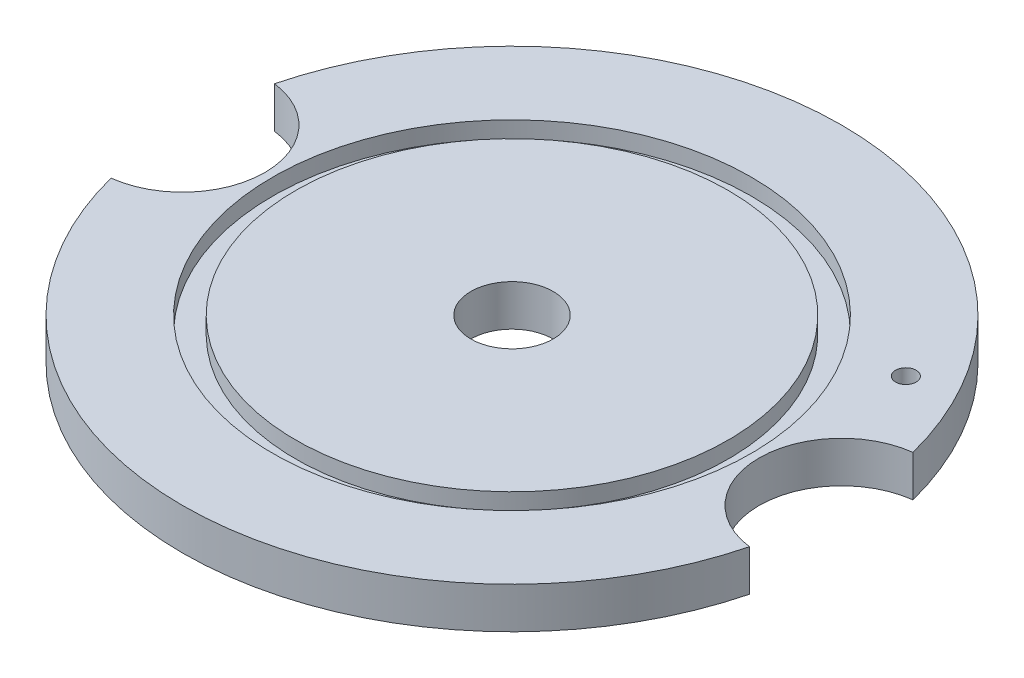
ISO-10303-21;
HEADER;
FILE_DESCRIPTION(('STEP AP214'),'2;1');
FILE_NAME('part.step','',(''),(''),'','','');
FILE_SCHEMA(('AUTOMOTIVE_DESIGN { 1 0 10303 214 1 1 1 1 }'));
ENDSEC;
DATA;
#1=APPLICATION_CONTEXT('core data for automotive mechanical design processes');
#2=APPLICATION_PROTOCOL_DEFINITION('international standard','automotive_design',2000,#1);
#3=PRODUCT_CONTEXT('',#1,'mechanical');
#4=PRODUCT('Part','Part','',(#3));
#5=PRODUCT_RELATED_PRODUCT_CATEGORY('part','',(#4));
#6=PRODUCT_DEFINITION_FORMATION('','',#4);
#7=PRODUCT_DEFINITION_CONTEXT('part definition',#1,'design');
#8=PRODUCT_DEFINITION('design','',#6,#7);
#9=PRODUCT_DEFINITION_SHAPE('','',#8);
#10=(LENGTH_UNIT() NAMED_UNIT(*) SI_UNIT(.MILLI.,.METRE.));
#11=(NAMED_UNIT(*) PLANE_ANGLE_UNIT() SI_UNIT($,.RADIAN.));
#12=(NAMED_UNIT(*) SI_UNIT($,.STERADIAN.) SOLID_ANGLE_UNIT());
#13=UNCERTAINTY_MEASURE_WITH_UNIT(LENGTH_MEASURE(1.E-05),#10,'distance_accuracy_value','');
#14=(GEOMETRIC_REPRESENTATION_CONTEXT(3) GLOBAL_UNCERTAINTY_ASSIGNED_CONTEXT((#13)) GLOBAL_UNIT_ASSIGNED_CONTEXT((#10,
#11,#12)) REPRESENTATION_CONTEXT('',''));
#15=CARTESIAN_POINT('',(0.,0.,0.));
#16=DIRECTION('',(0.,0.,1.));
#17=DIRECTION('',(1.,0.,0.));
#18=AXIS2_PLACEMENT_3D('',#15,#16,#17);
#19=CARTESIAN_POINT('',(0.,0.,0.));
#20=DIRECTION('',(0.,-1.,0.));
#21=DIRECTION('',(0.,0.,-1.));
#22=AXIS2_PLACEMENT_3D('',#19,#20,#21);
#23=CYLINDRICAL_SURFACE('',#22,50.8);
#24=CARTESIAN_POINT('',(0.,0.,0.));
#25=DIRECTION('',(0.,-1.,0.));
#26=DIRECTION('',(0.,0.,-1.));
#27=AXIS2_PLACEMENT_3D('',#24,#25,#26);
#28=CIRCLE('',#27,50.8);
#29=CARTESIAN_POINT('',(49.2125,0.,12.6003906189451));
#30=VERTEX_POINT('',#29);
#31=CARTESIAN_POINT('',(-49.2125,0.,12.6003906189451));
#32=VERTEX_POINT('',#31);
#33=EDGE_CURVE('E62',#30,#32,#28,.T.);
#34=ORIENTED_EDGE('',*,*,#33,.F.);
#35=DIRECTION('',(0.,1.,0.));
#36=VECTOR('',#35,1.);
#37=CARTESIAN_POINT('',(49.2125,3.17499999999999,12.6003906189451));
#38=LINE('',#37,#36);
#39=CARTESIAN_POINT('',(49.2125,6.35,12.6003906189451));
#40=VERTEX_POINT('',#39);
#41=EDGE_CURVE('E11',#30,#40,#38,.T.);
#42=ORIENTED_EDGE('',*,*,#41,.T.);
#43=CARTESIAN_POINT('',(0.,6.35,0.));
#44=DIRECTION('',(0.,-1.,0.));
#45=DIRECTION('',(0.,0.,-1.));
#46=AXIS2_PLACEMENT_3D('',#43,#44,#45);
#47=CIRCLE('',#46,50.8);
#48=CARTESIAN_POINT('',(-49.2125,6.35,12.6003906189451));
#49=VERTEX_POINT('',#48);
#50=EDGE_CURVE('E99',#40,#49,#47,.T.);
#51=ORIENTED_EDGE('',*,*,#50,.T.);
#52=DIRECTION('',(0.,1.,0.));
#53=VECTOR('',#52,1.);
#54=CARTESIAN_POINT('',(-49.2125,3.17499999999999,12.6003906189451));
#55=LINE('',#54,#53);
#56=EDGE_CURVE('E93',#49,#32,#55,.F.);
#57=ORIENTED_EDGE('',*,*,#56,.T.);
#58=EDGE_LOOP('',(#34,#42,#51,#57));
#59=FACE_BOUND('',#58,.T.);
#60=ADVANCED_FACE('F39',(#59),#23,.T.);
#61=CARTESIAN_POINT('',(-36.8935,6.35,0.));
#62=DIRECTION('',(0.,-1.,0.));
#63=DIRECTION('',(0.,0.,-1.));
#64=AXIS2_PLACEMENT_3D('',#61,#62,#63);
#65=PLANE('',#64);
#66=CARTESIAN_POINT('',(38.4948291982183,6.35,-22.2250000000001));
#67=DIRECTION('',(0.,1.,0.));
#68=DIRECTION('',(0.,0.,1.));
#69=AXIS2_PLACEMENT_3D('',#66,#67,#68);
#70=CIRCLE('',#69,1.5875);
#71=CARTESIAN_POINT('',(38.4948291982183,6.35,-20.6375000000001));
#72=VERTEX_POINT('',#71);
#73=EDGE_CURVE('E142',#72,#72,#70,.T.);
#74=ORIENTED_EDGE('',*,*,#73,.F.);
#75=EDGE_LOOP('',(#74));
#76=FACE_BOUND('',#75,.T.);
#77=CARTESIAN_POINT('',(0.,6.35,0.));
#78=DIRECTION('',(0.,-1.,0.));
#79=DIRECTION('',(0.,0.,-1.));
#80=AXIS2_PLACEMENT_3D('',#77,#78,#79);
#81=CIRCLE('',#80,36.8935);
#82=CARTESIAN_POINT('',(0.,6.35,-36.8935));
#83=VERTEX_POINT('',#82);
#84=EDGE_CURVE('E109',#83,#83,#81,.T.);
#85=ORIENTED_EDGE('',*,*,#84,.T.);
#86=EDGE_LOOP('',(#85));
#87=FACE_BOUND('',#86,.T.);
#88=ORIENTED_EDGE('',*,*,#50,.F.);
#89=CARTESIAN_POINT('',(50.8,6.35,0.));
#90=DIRECTION('',(0.,1.,0.));
#91=DIRECTION('',(0.,0.,1.));
#92=AXIS2_PLACEMENT_3D('',#89,#90,#91);
#93=CIRCLE('',#92,12.7);
#94=CARTESIAN_POINT('',(49.2125,6.35,-12.6003906189451));
#95=VERTEX_POINT('',#94);
#96=EDGE_CURVE('E81',#95,#40,#93,.T.);
#97=ORIENTED_EDGE('',*,*,#96,.F.);
#98=CARTESIAN_POINT('',(-49.2125,6.35,-12.6003906189451));
#99=VERTEX_POINT('',#98);
#100=EDGE_CURVE('E105',#99,#95,#47,.T.);
#101=ORIENTED_EDGE('',*,*,#100,.F.);
#102=CARTESIAN_POINT('',(-50.8,6.35,0.));
#103=DIRECTION('',(0.,1.,0.));
#104=DIRECTION('',(0.,0.,1.));
#105=AXIS2_PLACEMENT_3D('',#102,#103,#104);
#106=CIRCLE('',#105,12.7);
#107=EDGE_CURVE('E89',#49,#99,#106,.T.);
#108=ORIENTED_EDGE('',*,*,#107,.F.);
#109=EDGE_LOOP('',(#88,#97,#101,#108));
#110=FACE_BOUND('',#109,.T.);
#111=ADVANCED_FACE('F135',(#76,#87,#110),#65,.F.);
#112=CARTESIAN_POINT('',(0.,6.35,0.));
#113=DIRECTION('',(0.,-1.,0.));
#114=DIRECTION('',(0.,0.,-1.));
#115=AXIS2_PLACEMENT_3D('',#112,#113,#114);
#116=PLANE('',#115);
#117=CARTESIAN_POINT('',(0.,6.35,0.));
#118=DIRECTION('',(0.,1.,0.));
#119=DIRECTION('',(0.,0.,1.));
#120=AXIS2_PLACEMENT_3D('',#117,#118,#119);
#121=CIRCLE('',#120,6.35);
#122=CARTESIAN_POINT('',(0.,6.35,6.35));
#123=VERTEX_POINT('',#122);
#124=EDGE_CURVE('E101',#123,#123,#121,.T.);
#125=ORIENTED_EDGE('',*,*,#124,.F.);
#126=EDGE_LOOP('',(#125));
#127=FACE_BOUND('',#126,.T.);
#128=CARTESIAN_POINT('',(0.,6.35,0.));
#129=DIRECTION('',(0.,-1.,0.));
#130=DIRECTION('',(0.,0.,-1.));
#131=AXIS2_PLACEMENT_3D('',#128,#129,#130);
#132=CIRCLE('',#131,33.3375);
#133=CARTESIAN_POINT('',(0.,6.35,-33.3375));
#134=VERTEX_POINT('',#133);
#135=EDGE_CURVE('E121',#134,#134,#132,.T.);
#136=ORIENTED_EDGE('',*,*,#135,.F.);
#137=EDGE_LOOP('',(#136));
#138=FACE_BOUND('',#137,.T.);
#139=ADVANCED_FACE('F41',(#127,#138),#116,.F.);
#140=CARTESIAN_POINT('',(0.,0.,0.));
#141=DIRECTION('',(0.,-1.,0.));
#142=DIRECTION('',(0.,0.,-1.));
#143=AXIS2_PLACEMENT_3D('',#140,#141,#142);
#144=CYLINDRICAL_SURFACE('',#143,33.3375);
#145=CARTESIAN_POINT('',(0.,3.81,0.));
#146=DIRECTION('',(0.,-1.,0.));
#147=DIRECTION('',(0.,0.,-1.));
#148=AXIS2_PLACEMENT_3D('',#145,#146,#147);
#149=CIRCLE('',#148,33.3375);
#150=CARTESIAN_POINT('',(0.,3.81,-33.3375));
#151=VERTEX_POINT('',#150);
#152=EDGE_CURVE('E117',#151,#151,#149,.T.);
#153=ORIENTED_EDGE('',*,*,#152,.F.);
#154=EDGE_LOOP('',(#153));
#155=FACE_BOUND('',#154,.T.);
#156=ORIENTED_EDGE('',*,*,#135,.T.);
#157=EDGE_LOOP('',(#156));
#158=FACE_BOUND('',#157,.T.);
#159=ADVANCED_FACE('F158',(#155,#158),#144,.T.);
#160=CARTESIAN_POINT('',(-33.3375,3.81,0.));
#161=DIRECTION('',(0.,-1.,0.));
#162=DIRECTION('',(0.,0.,-1.));
#163=AXIS2_PLACEMENT_3D('',#160,#161,#162);
#164=PLANE('',#163);
#165=CARTESIAN_POINT('',(0.,3.81,0.));
#166=DIRECTION('',(0.,-1.,0.));
#167=DIRECTION('',(0.,0.,-1.));
#168=AXIS2_PLACEMENT_3D('',#165,#166,#167);
#169=CIRCLE('',#168,36.8935);
#170=CARTESIAN_POINT('',(0.,3.81,-36.8935));
#171=VERTEX_POINT('',#170);
#172=EDGE_CURVE('E113',#171,#171,#169,.T.);
#173=ORIENTED_EDGE('',*,*,#172,.F.);
#174=EDGE_LOOP('',(#173));
#175=FACE_BOUND('',#174,.T.);
#176=ORIENTED_EDGE('',*,*,#152,.T.);
#177=EDGE_LOOP('',(#176));
#178=FACE_BOUND('',#177,.T.);
#179=ADVANCED_FACE('F162',(#175,#178),#164,.F.);
#180=CARTESIAN_POINT('',(0.,0.,0.));
#181=DIRECTION('',(0.,-1.,0.));
#182=DIRECTION('',(0.,0.,-1.));
#183=AXIS2_PLACEMENT_3D('',#180,#181,#182);
#184=CYLINDRICAL_SURFACE('',#183,36.8935);
#185=ORIENTED_EDGE('',*,*,#84,.F.);
#186=EDGE_LOOP('',(#185));
#187=FACE_BOUND('',#186,.T.);
#188=ORIENTED_EDGE('',*,*,#172,.T.);
#189=EDGE_LOOP('',(#188));
#190=FACE_BOUND('',#189,.T.);
#191=ADVANCED_FACE('F167',(#187,#190),#184,.F.);
#192=ORIENTED_EDGE('',*,*,#100,.T.);
#193=DIRECTION('',(0.,1.,0.));
#194=VECTOR('',#193,1.);
#195=CARTESIAN_POINT('',(49.2125,3.17499999999999,-12.6003906189451));
#196=LINE('',#195,#194);
#197=CARTESIAN_POINT('',(49.2125,0.,-12.6003906189451));
#198=VERTEX_POINT('',#197);
#199=EDGE_CURVE('E48',#95,#198,#196,.F.);
#200=ORIENTED_EDGE('',*,*,#199,.T.);
#201=CARTESIAN_POINT('',(-49.2125,0.,-12.6003906189451));
#202=VERTEX_POINT('',#201);
#203=EDGE_CURVE('E87',#202,#198,#28,.T.);
#204=ORIENTED_EDGE('',*,*,#203,.F.);
#205=DIRECTION('',(0.,1.,0.));
#206=VECTOR('',#205,1.);
#207=CARTESIAN_POINT('',(-49.2125,3.17499999999999,-12.6003906189451));
#208=LINE('',#207,#206);
#209=EDGE_CURVE('E127',#202,#99,#208,.T.);
#210=ORIENTED_EDGE('',*,*,#209,.T.);
#211=EDGE_LOOP('',(#192,#200,#204,#210));
#212=FACE_BOUND('',#211,.T.);
#213=ADVANCED_FACE('F132',(#212),#23,.T.);
#214=CARTESIAN_POINT('',(0.,0.,0.));
#215=DIRECTION('',(0.,1.,0.));
#216=DIRECTION('',(0.,0.,1.));
#217=AXIS2_PLACEMENT_3D('',#214,#215,#216);
#218=PLANE('',#217);
#219=CARTESIAN_POINT('',(38.4948291982183,0.,-22.2250000000001));
#220=DIRECTION('',(0.,1.,0.));
#221=DIRECTION('',(0.,0.,1.));
#222=AXIS2_PLACEMENT_3D('',#219,#220,#221);
#223=CIRCLE('',#222,1.5875);
#224=CARTESIAN_POINT('',(38.4948291982183,0.,-20.6375000000001));
#225=VERTEX_POINT('',#224);
#226=EDGE_CURVE('E138',#225,#225,#223,.T.);
#227=ORIENTED_EDGE('',*,*,#226,.T.);
#228=EDGE_LOOP('',(#227));
#229=FACE_BOUND('',#228,.T.);
#230=CARTESIAN_POINT('',(0.,0.,0.));
#231=DIRECTION('',(0.,1.,0.));
#232=DIRECTION('',(0.,0.,1.));
#233=AXIS2_PLACEMENT_3D('',#230,#231,#232);
#234=CIRCLE('',#233,6.35);
#235=CARTESIAN_POINT('',(0.,0.,6.35));
#236=VERTEX_POINT('',#235);
#237=EDGE_CURVE('E95',#236,#236,#234,.T.);
#238=ORIENTED_EDGE('',*,*,#237,.T.);
#239=EDGE_LOOP('',(#238));
#240=FACE_BOUND('',#239,.T.);
#241=ORIENTED_EDGE('',*,*,#203,.T.);
#242=CARTESIAN_POINT('',(50.8,0.,0.));
#243=DIRECTION('',(0.,1.,0.));
#244=DIRECTION('',(0.,0.,1.));
#245=AXIS2_PLACEMENT_3D('',#242,#243,#244);
#246=CIRCLE('',#245,12.7);
#247=EDGE_CURVE('E55',#198,#30,#246,.T.);
#248=ORIENTED_EDGE('',*,*,#247,.T.);
#249=ORIENTED_EDGE('',*,*,#33,.T.);
#250=CARTESIAN_POINT('',(-50.8,0.,0.));
#251=DIRECTION('',(0.,1.,0.));
#252=DIRECTION('',(0.,0.,1.));
#253=AXIS2_PLACEMENT_3D('',#250,#251,#252);
#254=CIRCLE('',#253,12.7);
#255=EDGE_CURVE('E148',#32,#202,#254,.T.);
#256=ORIENTED_EDGE('',*,*,#255,.T.);
#257=EDGE_LOOP('',(#241,#248,#249,#256));
#258=FACE_BOUND('',#257,.T.);
#259=ADVANCED_FACE('F85',(#229,#240,#258),#218,.F.);
#260=CARTESIAN_POINT('',(0.,6.35,0.));
#261=DIRECTION('',(0.,1.,0.));
#262=DIRECTION('',(0.,0.,1.));
#263=AXIS2_PLACEMENT_3D('',#260,#261,#262);
#264=CYLINDRICAL_SURFACE('',#263,6.35);
#265=ORIENTED_EDGE('',*,*,#237,.F.);
#266=EDGE_LOOP('',(#265));
#267=FACE_BOUND('',#266,.T.);
#268=ORIENTED_EDGE('',*,*,#124,.T.);
#269=EDGE_LOOP('',(#268));
#270=FACE_BOUND('',#269,.T.);
#271=ADVANCED_FACE('F154',(#267,#270),#264,.F.);
#272=CARTESIAN_POINT('',(-50.8,6.35,0.));
#273=DIRECTION('',(0.,1.,0.));
#274=DIRECTION('',(0.,0.,1.));
#275=AXIS2_PLACEMENT_3D('',#272,#273,#274);
#276=CYLINDRICAL_SURFACE('',#275,12.7);
#277=ORIENTED_EDGE('',*,*,#255,.F.);
#278=ORIENTED_EDGE('',*,*,#56,.F.);
#279=ORIENTED_EDGE('',*,*,#107,.T.);
#280=ORIENTED_EDGE('',*,*,#209,.F.);
#281=EDGE_LOOP('',(#277,#278,#279,#280));
#282=FACE_BOUND('',#281,.T.);
#283=ADVANCED_FACE('F216',(#282),#276,.F.);
#284=CARTESIAN_POINT('',(50.8,6.35,0.));
#285=DIRECTION('',(0.,1.,0.));
#286=DIRECTION('',(0.,0.,1.));
#287=AXIS2_PLACEMENT_3D('',#284,#285,#286);
#288=CYLINDRICAL_SURFACE('',#287,12.7);
#289=ORIENTED_EDGE('',*,*,#247,.F.);
#290=ORIENTED_EDGE('',*,*,#199,.F.);
#291=ORIENTED_EDGE('',*,*,#96,.T.);
#292=ORIENTED_EDGE('',*,*,#41,.F.);
#293=EDGE_LOOP('',(#289,#290,#291,#292));
#294=FACE_BOUND('',#293,.T.);
#295=ADVANCED_FACE('F79',(#294),#288,.F.);
#296=CARTESIAN_POINT('',(38.4948291982183,6.35,-22.2250000000001));
#297=DIRECTION('',(0.,1.,0.));
#298=DIRECTION('',(0.,0.,1.));
#299=AXIS2_PLACEMENT_3D('',#296,#297,#298);
#300=CYLINDRICAL_SURFACE('',#299,1.5875);
#301=ORIENTED_EDGE('',*,*,#226,.F.);
#302=EDGE_LOOP('',(#301));
#303=FACE_BOUND('',#302,.T.);
#304=ORIENTED_EDGE('',*,*,#73,.T.);
#305=EDGE_LOOP('',(#304));
#306=FACE_BOUND('',#305,.T.);
#307=ADVANCED_FACE('F246',(#303,#306),#300,.F.);
#308=CLOSED_SHELL('',(#60,#111,#139,#159,#179,#191,#213,#259,#271,#283,#295,#307));
#309=MANIFOLD_SOLID_BREP('B2',#308);
#310=ADVANCED_BREP_SHAPE_REPRESENTATION('',(#18,#309),#14);
#311=SHAPE_DEFINITION_REPRESENTATION(#9,#310);
ENDSEC;
END-ISO-10303-21;
